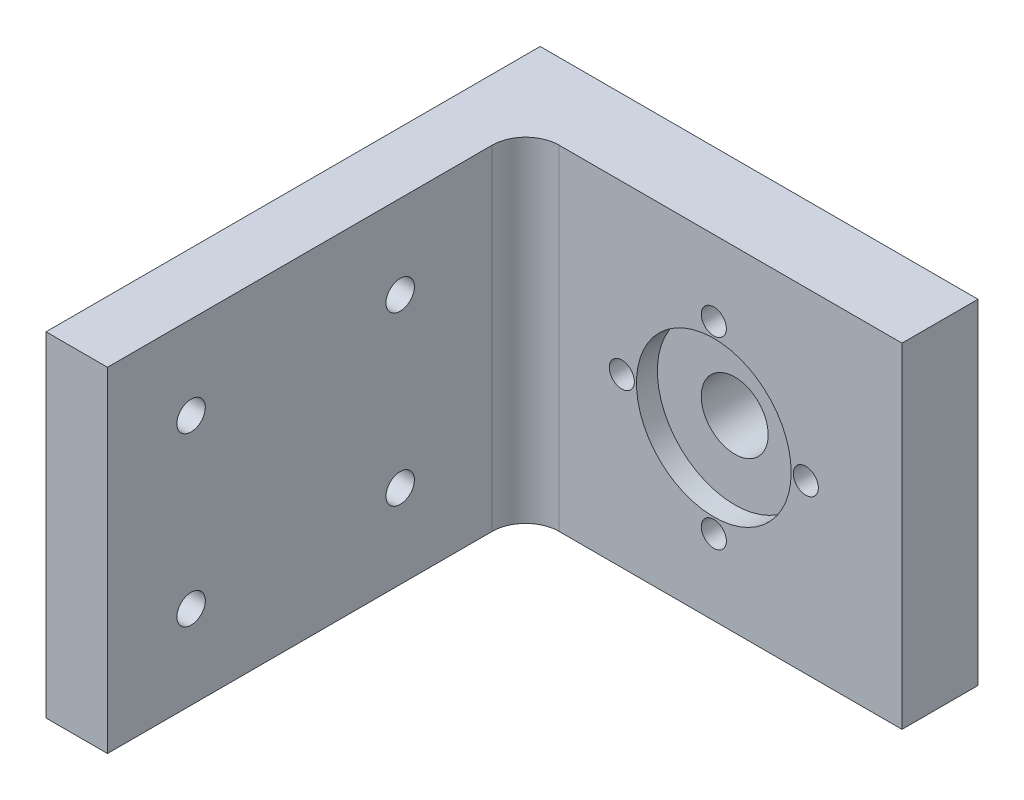
ISO-10303-21;
HEADER;
FILE_DESCRIPTION(('STEP AP214'),'2;1');
FILE_NAME('part.step','',(''),(''),'','','');
FILE_SCHEMA(('AUTOMOTIVE_DESIGN { 1 0 10303 214 1 1 1 1 }'));
ENDSEC;
DATA;
#1=APPLICATION_CONTEXT('core data for automotive mechanical design processes');
#2=APPLICATION_PROTOCOL_DEFINITION('international standard','automotive_design',2000,#1);
#3=PRODUCT_CONTEXT('',#1,'mechanical');
#4=PRODUCT('Part','Part','',(#3));
#5=PRODUCT_RELATED_PRODUCT_CATEGORY('part','',(#4));
#6=PRODUCT_DEFINITION_FORMATION('','',#4);
#7=PRODUCT_DEFINITION_CONTEXT('part definition',#1,'design');
#8=PRODUCT_DEFINITION('design','',#6,#7);
#9=PRODUCT_DEFINITION_SHAPE('','',#8);
#10=(LENGTH_UNIT() NAMED_UNIT(*) SI_UNIT(.MILLI.,.METRE.));
#11=(NAMED_UNIT(*) PLANE_ANGLE_UNIT() SI_UNIT($,.RADIAN.));
#12=(NAMED_UNIT(*) SI_UNIT($,.STERADIAN.) SOLID_ANGLE_UNIT());
#13=UNCERTAINTY_MEASURE_WITH_UNIT(LENGTH_MEASURE(1.E-05),#10,'distance_accuracy_value','');
#14=(GEOMETRIC_REPRESENTATION_CONTEXT(3) GLOBAL_UNCERTAINTY_ASSIGNED_CONTEXT((#13)) GLOBAL_UNIT_ASSIGNED_CONTEXT((#10,
#11,#12)) REPRESENTATION_CONTEXT('',''));
#15=CARTESIAN_POINT('',(0.,0.,0.));
#16=DIRECTION('',(0.,0.,1.));
#17=DIRECTION('',(1.,0.,0.));
#18=AXIS2_PLACEMENT_3D('',#15,#16,#17);
#19=CARTESIAN_POINT('',(22.5,-20.,9.09));
#20=DIRECTION('',(0.,-1.,0.));
#21=DIRECTION('',(0.,0.,-1.));
#22=AXIS2_PLACEMENT_3D('',#19,#20,#21);
#23=PLANE('',#22);
#24=DIRECTION('',(-1.,0.,0.));
#25=VECTOR('',#24,1.);
#26=CARTESIAN_POINT('',(22.5,-20.,0.));
#27=LINE('',#26,#25);
#28=CARTESIAN_POINT('',(22.5,-20.,0.));
#29=VERTEX_POINT('',#28);
#30=CARTESIAN_POINT('',(-29.85,-20.,0.));
#31=VERTEX_POINT('',#30);
#32=EDGE_CURVE('E114',#29,#31,#27,.T.);
#33=ORIENTED_EDGE('',*,*,#32,.F.);
#34=DIRECTION('',(0.,0.,-1.));
#35=VECTOR('',#34,1.);
#36=CARTESIAN_POINT('',(22.5,-20.,9.09));
#37=LINE('',#36,#35);
#38=CARTESIAN_POINT('',(22.5,-20.,9.09));
#39=VERTEX_POINT('',#38);
#40=EDGE_CURVE('E191',#39,#29,#37,.T.);
#41=ORIENTED_EDGE('',*,*,#40,.F.);
#42=DIRECTION('',(-1.,0.,0.));
#43=VECTOR('',#42,1.);
#44=CARTESIAN_POINT('',(22.5,-20.,9.09));
#45=LINE('',#44,#43);
#46=CARTESIAN_POINT('',(-18.5,-20.,9.09));
#47=VERTEX_POINT('',#46);
#48=EDGE_CURVE('E183',#39,#47,#45,.T.);
#49=ORIENTED_EDGE('',*,*,#48,.T.);
#50=CARTESIAN_POINT('',(-18.5,-20.,13.09));
#51=DIRECTION('',(0.,-1.,0.));
#52=DIRECTION('',(0.,0.,-1.));
#53=AXIS2_PLACEMENT_3D('',#50,#51,#52);
#54=CIRCLE('',#53,4.);
#55=CARTESIAN_POINT('',(-22.5,-20.,13.09));
#56=VERTEX_POINT('',#55);
#57=EDGE_CURVE('E11',#47,#56,#54,.F.);
#58=ORIENTED_EDGE('',*,*,#57,.T.);
#59=DIRECTION('',(0.,0.,1.));
#60=VECTOR('',#59,1.);
#61=CARTESIAN_POINT('',(-22.5,-20.,0.));
#62=LINE('',#61,#60);
#63=CARTESIAN_POINT('',(-22.5,-20.,59.09));
#64=VERTEX_POINT('',#63);
#65=EDGE_CURVE('E130',#56,#64,#62,.T.);
#66=ORIENTED_EDGE('',*,*,#65,.T.);
#67=DIRECTION('',(1.,0.,0.));
#68=VECTOR('',#67,1.);
#69=CARTESIAN_POINT('',(-29.85,-20.,59.09));
#70=LINE('',#69,#68);
#71=CARTESIAN_POINT('',(-29.85,-20.,59.09));
#72=VERTEX_POINT('',#71);
#73=EDGE_CURVE('E144',#72,#64,#70,.T.);
#74=ORIENTED_EDGE('',*,*,#73,.F.);
#75=DIRECTION('',(0.,0.,1.));
#76=VECTOR('',#75,1.);
#77=CARTESIAN_POINT('',(-29.85,-20.,0.));
#78=LINE('',#77,#76);
#79=EDGE_CURVE('E122',#31,#72,#78,.T.);
#80=ORIENTED_EDGE('',*,*,#79,.F.);
#81=EDGE_LOOP('',(#33,#41,#49,#58,#66,#74,#80));
#82=FACE_BOUND('',#81,.T.);
#83=ADVANCED_FACE('F44',(#82),#23,.T.);
#84=CARTESIAN_POINT('',(22.5,-20.,9.09));
#85=DIRECTION('',(-1.,0.,0.));
#86=DIRECTION('',(0.,0.,1.));
#87=AXIS2_PLACEMENT_3D('',#84,#85,#86);
#88=PLANE('',#87);
#89=DIRECTION('',(0.,1.,0.));
#90=VECTOR('',#89,1.);
#91=CARTESIAN_POINT('',(22.5,-20.,0.));
#92=LINE('',#91,#90);
#93=CARTESIAN_POINT('',(22.5,20.,0.));
#94=VERTEX_POINT('',#93);
#95=EDGE_CURVE('E113',#29,#94,#92,.T.);
#96=ORIENTED_EDGE('',*,*,#95,.T.);
#97=DIRECTION('',(0.,0.,-1.));
#98=VECTOR('',#97,1.);
#99=CARTESIAN_POINT('',(22.5,20.,9.09));
#100=LINE('',#99,#98);
#101=CARTESIAN_POINT('',(22.5,20.,9.09));
#102=VERTEX_POINT('',#101);
#103=EDGE_CURVE('E110',#102,#94,#100,.T.);
#104=ORIENTED_EDGE('',*,*,#103,.F.);
#105=DIRECTION('',(0.,1.,0.));
#106=VECTOR('',#105,1.);
#107=CARTESIAN_POINT('',(22.5,-20.,9.09));
#108=LINE('',#107,#106);
#109=EDGE_CURVE('E187',#39,#102,#108,.T.);
#110=ORIENTED_EDGE('',*,*,#109,.F.);
#111=ORIENTED_EDGE('',*,*,#40,.T.);
#112=EDGE_LOOP('',(#96,#104,#110,#111));
#113=FACE_BOUND('',#112,.T.);
#114=ADVANCED_FACE('F219',(#113),#88,.F.);
#115=CARTESIAN_POINT('',(22.5,20.,9.09));
#116=DIRECTION('',(0.,-1.,0.));
#117=DIRECTION('',(0.,0.,-1.));
#118=AXIS2_PLACEMENT_3D('',#115,#116,#117);
#119=PLANE('',#118);
#120=DIRECTION('',(-1.,0.,0.));
#121=VECTOR('',#120,1.);
#122=CARTESIAN_POINT('',(22.5,20.,0.));
#123=LINE('',#122,#121);
#124=CARTESIAN_POINT('',(-29.85,20.,0.));
#125=VERTEX_POINT('',#124);
#126=EDGE_CURVE('E103',#94,#125,#123,.T.);
#127=ORIENTED_EDGE('',*,*,#126,.T.);
#128=DIRECTION('',(0.,0.,-1.));
#129=VECTOR('',#128,1.);
#130=CARTESIAN_POINT('',(-29.85,20.,0.));
#131=LINE('',#130,#129);
#132=CARTESIAN_POINT('',(-29.85,20.,59.09));
#133=VERTEX_POINT('',#132);
#134=EDGE_CURVE('E108',#133,#125,#131,.T.);
#135=ORIENTED_EDGE('',*,*,#134,.F.);
#136=DIRECTION('',(1.,0.,0.));
#137=VECTOR('',#136,1.);
#138=CARTESIAN_POINT('',(-29.85,20.,59.09));
#139=LINE('',#138,#137);
#140=CARTESIAN_POINT('',(-22.5,20.,59.09));
#141=VERTEX_POINT('',#140);
#142=EDGE_CURVE('E138',#133,#141,#139,.T.);
#143=ORIENTED_EDGE('',*,*,#142,.T.);
#144=DIRECTION('',(0.,0.,-1.));
#145=VECTOR('',#144,1.);
#146=CARTESIAN_POINT('',(-22.5,20.,0.));
#147=LINE('',#146,#145);
#148=CARTESIAN_POINT('',(-22.5,20.,13.09));
#149=VERTEX_POINT('',#148);
#150=EDGE_CURVE('E139',#141,#149,#147,.T.);
#151=ORIENTED_EDGE('',*,*,#150,.T.);
#152=CARTESIAN_POINT('',(-18.5,20.,13.09));
#153=DIRECTION('',(0.,-1.,0.));
#154=DIRECTION('',(0.,0.,-1.));
#155=AXIS2_PLACEMENT_3D('',#152,#153,#154);
#156=CIRCLE('',#155,4.);
#157=CARTESIAN_POINT('',(-18.5,20.,9.09));
#158=VERTEX_POINT('',#157);
#159=EDGE_CURVE('E52',#149,#158,#156,.T.);
#160=ORIENTED_EDGE('',*,*,#159,.T.);
#161=DIRECTION('',(-1.,0.,0.));
#162=VECTOR('',#161,1.);
#163=CARTESIAN_POINT('',(22.5,20.,9.09));
#164=LINE('',#163,#162);
#165=EDGE_CURVE('E185',#102,#158,#164,.T.);
#166=ORIENTED_EDGE('',*,*,#165,.F.);
#167=ORIENTED_EDGE('',*,*,#103,.T.);
#168=EDGE_LOOP('',(#127,#135,#143,#151,#160,#166,#167));
#169=FACE_BOUND('',#168,.T.);
#170=ADVANCED_FACE('F105',(#169),#119,.F.);
#171=CARTESIAN_POINT('',(0.,0.,9.09));
#172=DIRECTION('',(0.,0.,-1.));
#173=DIRECTION('',(-1.,0.,0.));
#174=AXIS2_PLACEMENT_3D('',#171,#172,#173);
#175=PLANE('',#174);
#176=CARTESIAN_POINT('',(0.,0.,9.09));
#177=DIRECTION('',(0.,0.,1.));
#178=DIRECTION('',(1.,0.,0.));
#179=AXIS2_PLACEMENT_3D('',#176,#177,#178);
#180=CIRCLE('',#179,9.25);
#181=CARTESIAN_POINT('',(9.25,0.,9.09));
#182=VERTEX_POINT('',#181);
#183=EDGE_CURVE('E151',#182,#182,#180,.T.);
#184=ORIENTED_EDGE('',*,*,#183,.F.);
#185=EDGE_LOOP('',(#184));
#186=FACE_BOUND('',#185,.T.);
#187=CARTESIAN_POINT('',(0.,11.,9.09));
#188=DIRECTION('',(0.,0.,1.));
#189=DIRECTION('',(1.,0.,0.));
#190=AXIS2_PLACEMENT_3D('',#187,#188,#189);
#191=CIRCLE('',#190,1.5);
#192=CARTESIAN_POINT('',(1.5,11.,9.09));
#193=VERTEX_POINT('',#192);
#194=EDGE_CURVE('E163',#193,#193,#191,.T.);
#195=ORIENTED_EDGE('',*,*,#194,.F.);
#196=EDGE_LOOP('',(#195));
#197=FACE_BOUND('',#196,.T.);
#198=CARTESIAN_POINT('',(11.,0.,9.09));
#199=DIRECTION('',(0.,0.,1.));
#200=DIRECTION('',(1.,0.,0.));
#201=AXIS2_PLACEMENT_3D('',#198,#199,#200);
#202=CIRCLE('',#201,1.5);
#203=CARTESIAN_POINT('',(12.5,0.,9.09));
#204=VERTEX_POINT('',#203);
#205=EDGE_CURVE('E166',#204,#204,#202,.T.);
#206=ORIENTED_EDGE('',*,*,#205,.F.);
#207=EDGE_LOOP('',(#206));
#208=FACE_BOUND('',#207,.T.);
#209=CARTESIAN_POINT('',(0.,-11.,9.09));
#210=DIRECTION('',(0.,0.,1.));
#211=DIRECTION('',(1.,0.,0.));
#212=AXIS2_PLACEMENT_3D('',#209,#210,#211);
#213=CIRCLE('',#212,1.5);
#214=CARTESIAN_POINT('',(1.5,-11.,9.09));
#215=VERTEX_POINT('',#214);
#216=EDGE_CURVE('E172',#215,#215,#213,.T.);
#217=ORIENTED_EDGE('',*,*,#216,.F.);
#218=EDGE_LOOP('',(#217));
#219=FACE_BOUND('',#218,.T.);
#220=CARTESIAN_POINT('',(-11.,0.,9.09));
#221=DIRECTION('',(0.,0.,1.));
#222=DIRECTION('',(1.,0.,0.));
#223=AXIS2_PLACEMENT_3D('',#220,#221,#222);
#224=CIRCLE('',#223,1.5);
#225=CARTESIAN_POINT('',(-9.5,0.,9.09));
#226=VERTEX_POINT('',#225);
#227=EDGE_CURVE('E178',#226,#226,#224,.T.);
#228=ORIENTED_EDGE('',*,*,#227,.F.);
#229=EDGE_LOOP('',(#228));
#230=FACE_BOUND('',#229,.T.);
#231=ORIENTED_EDGE('',*,*,#165,.T.);
#232=DIRECTION('',(0.,1.,0.));
#233=VECTOR('',#232,1.);
#234=CARTESIAN_POINT('',(-18.5,0.,9.09));
#235=LINE('',#234,#233);
#236=EDGE_CURVE('E65',#158,#47,#235,.F.);
#237=ORIENTED_EDGE('',*,*,#236,.T.);
#238=ORIENTED_EDGE('',*,*,#48,.F.);
#239=ORIENTED_EDGE('',*,*,#109,.T.);
#240=EDGE_LOOP('',(#231,#237,#238,#239));
#241=FACE_BOUND('',#240,.T.);
#242=ADVANCED_FACE('F227',(#186,#197,#208,#219,#230,#241),#175,.F.);
#243=CARTESIAN_POINT('',(0.,0.,0.));
#244=DIRECTION('',(0.,0.,-1.));
#245=DIRECTION('',(-1.,0.,0.));
#246=AXIS2_PLACEMENT_3D('',#243,#244,#245);
#247=PLANE('',#246);
#248=CARTESIAN_POINT('',(0.,0.,0.));
#249=DIRECTION('',(0.,0.,1.));
#250=DIRECTION('',(1.,0.,0.));
#251=AXIS2_PLACEMENT_3D('',#248,#249,#250);
#252=CIRCLE('',#251,4.);
#253=CARTESIAN_POINT('',(4.,0.,0.));
#254=VERTEX_POINT('',#253);
#255=EDGE_CURVE('E148',#254,#254,#252,.T.);
#256=ORIENTED_EDGE('',*,*,#255,.T.);
#257=EDGE_LOOP('',(#256));
#258=FACE_BOUND('',#257,.T.);
#259=CARTESIAN_POINT('',(0.,11.,0.));
#260=DIRECTION('',(0.,0.,1.));
#261=DIRECTION('',(1.,0.,0.));
#262=AXIS2_PLACEMENT_3D('',#259,#260,#261);
#263=CIRCLE('',#262,1.5);
#264=CARTESIAN_POINT('',(1.5,11.,0.));
#265=VERTEX_POINT('',#264);
#266=EDGE_CURVE('E160',#265,#265,#263,.T.);
#267=ORIENTED_EDGE('',*,*,#266,.T.);
#268=EDGE_LOOP('',(#267));
#269=FACE_BOUND('',#268,.T.);
#270=CARTESIAN_POINT('',(11.,0.,0.));
#271=DIRECTION('',(0.,0.,1.));
#272=DIRECTION('',(1.,0.,0.));
#273=AXIS2_PLACEMENT_3D('',#270,#271,#272);
#274=CIRCLE('',#273,1.5);
#275=CARTESIAN_POINT('',(12.5,0.,0.));
#276=VERTEX_POINT('',#275);
#277=EDGE_CURVE('E169',#276,#276,#274,.T.);
#278=ORIENTED_EDGE('',*,*,#277,.T.);
#279=EDGE_LOOP('',(#278));
#280=FACE_BOUND('',#279,.T.);
#281=CARTESIAN_POINT('',(0.,-11.,0.));
#282=DIRECTION('',(0.,0.,1.));
#283=DIRECTION('',(1.,0.,0.));
#284=AXIS2_PLACEMENT_3D('',#281,#282,#283);
#285=CIRCLE('',#284,1.5);
#286=CARTESIAN_POINT('',(1.5,-11.,0.));
#287=VERTEX_POINT('',#286);
#288=EDGE_CURVE('E175',#287,#287,#285,.T.);
#289=ORIENTED_EDGE('',*,*,#288,.T.);
#290=EDGE_LOOP('',(#289));
#291=FACE_BOUND('',#290,.T.);
#292=CARTESIAN_POINT('',(-11.,0.,0.));
#293=DIRECTION('',(0.,0.,1.));
#294=DIRECTION('',(1.,0.,0.));
#295=AXIS2_PLACEMENT_3D('',#292,#293,#294);
#296=CIRCLE('',#295,1.5);
#297=CARTESIAN_POINT('',(-9.5,0.,0.));
#298=VERTEX_POINT('',#297);
#299=EDGE_CURVE('E157',#298,#298,#296,.T.);
#300=ORIENTED_EDGE('',*,*,#299,.T.);
#301=EDGE_LOOP('',(#300));
#302=FACE_BOUND('',#301,.T.);
#303=ORIENTED_EDGE('',*,*,#32,.T.);
#304=DIRECTION('',(0.,-1.,0.));
#305=VECTOR('',#304,1.);
#306=CARTESIAN_POINT('',(-29.85,20.,0.));
#307=LINE('',#306,#305);
#308=EDGE_CURVE('E117',#125,#31,#307,.T.);
#309=ORIENTED_EDGE('',*,*,#308,.F.);
#310=ORIENTED_EDGE('',*,*,#126,.F.);
#311=ORIENTED_EDGE('',*,*,#95,.F.);
#312=EDGE_LOOP('',(#303,#309,#310,#311));
#313=FACE_BOUND('',#312,.T.);
#314=ADVANCED_FACE('F118',(#258,#269,#280,#291,#302,#313),#247,.T.);
#315=CARTESIAN_POINT('',(-11.,0.,0.));
#316=DIRECTION('',(0.,0.,1.));
#317=DIRECTION('',(1.,0.,0.));
#318=AXIS2_PLACEMENT_3D('',#315,#316,#317);
#319=CYLINDRICAL_SURFACE('',#318,1.5);
#320=ORIENTED_EDGE('',*,*,#299,.F.);
#321=EDGE_LOOP('',(#320));
#322=FACE_BOUND('',#321,.T.);
#323=ORIENTED_EDGE('',*,*,#227,.T.);
#324=EDGE_LOOP('',(#323));
#325=FACE_BOUND('',#324,.T.);
#326=ADVANCED_FACE('F231',(#322,#325),#319,.F.);
#327=CARTESIAN_POINT('',(0.,-11.,0.));
#328=DIRECTION('',(0.,0.,1.));
#329=DIRECTION('',(1.,0.,0.));
#330=AXIS2_PLACEMENT_3D('',#327,#328,#329);
#331=CYLINDRICAL_SURFACE('',#330,1.5);
#332=ORIENTED_EDGE('',*,*,#288,.F.);
#333=EDGE_LOOP('',(#332));
#334=FACE_BOUND('',#333,.T.);
#335=ORIENTED_EDGE('',*,*,#216,.T.);
#336=EDGE_LOOP('',(#335));
#337=FACE_BOUND('',#336,.T.);
#338=ADVANCED_FACE('F238',(#334,#337),#331,.F.);
#339=CARTESIAN_POINT('',(11.,0.,0.));
#340=DIRECTION('',(0.,0.,1.));
#341=DIRECTION('',(1.,0.,0.));
#342=AXIS2_PLACEMENT_3D('',#339,#340,#341);
#343=CYLINDRICAL_SURFACE('',#342,1.5);
#344=ORIENTED_EDGE('',*,*,#277,.F.);
#345=EDGE_LOOP('',(#344));
#346=FACE_BOUND('',#345,.T.);
#347=ORIENTED_EDGE('',*,*,#205,.T.);
#348=EDGE_LOOP('',(#347));
#349=FACE_BOUND('',#348,.T.);
#350=ADVANCED_FACE('F242',(#346,#349),#343,.F.);
#351=CARTESIAN_POINT('',(0.,11.,0.));
#352=DIRECTION('',(0.,0.,1.));
#353=DIRECTION('',(1.,0.,0.));
#354=AXIS2_PLACEMENT_3D('',#351,#352,#353);
#355=CYLINDRICAL_SURFACE('',#354,1.5);
#356=ORIENTED_EDGE('',*,*,#266,.F.);
#357=EDGE_LOOP('',(#356));
#358=FACE_BOUND('',#357,.T.);
#359=ORIENTED_EDGE('',*,*,#194,.T.);
#360=EDGE_LOOP('',(#359));
#361=FACE_BOUND('',#360,.T.);
#362=ADVANCED_FACE('F246',(#358,#361),#355,.F.);
#363=CARTESIAN_POINT('',(0.,0.,6.59));
#364=DIRECTION('',(0.,0.,1.));
#365=DIRECTION('',(1.,0.,0.));
#366=AXIS2_PLACEMENT_3D('',#363,#364,#365);
#367=CYLINDRICAL_SURFACE('',#366,9.25);
#368=CARTESIAN_POINT('',(0.,0.,6.59));
#369=DIRECTION('',(0.,0.,1.));
#370=DIRECTION('',(1.,0.,0.));
#371=AXIS2_PLACEMENT_3D('',#368,#369,#370);
#372=CIRCLE('',#371,9.25);
#373=CARTESIAN_POINT('',(9.25,0.,6.59));
#374=VERTEX_POINT('',#373);
#375=EDGE_CURVE('E154',#374,#374,#372,.T.);
#376=ORIENTED_EDGE('',*,*,#375,.F.);
#377=EDGE_LOOP('',(#376));
#378=FACE_BOUND('',#377,.T.);
#379=ORIENTED_EDGE('',*,*,#183,.T.);
#380=EDGE_LOOP('',(#379));
#381=FACE_BOUND('',#380,.T.);
#382=ADVANCED_FACE('F250',(#378,#381),#367,.F.);
#383=CARTESIAN_POINT('',(0.,0.,6.59));
#384=DIRECTION('',(0.,0.,1.));
#385=DIRECTION('',(1.,0.,0.));
#386=AXIS2_PLACEMENT_3D('',#383,#384,#385);
#387=PLANE('',#386);
#388=CARTESIAN_POINT('',(0.,0.,6.59));
#389=DIRECTION('',(0.,0.,1.));
#390=DIRECTION('',(1.,0.,0.));
#391=AXIS2_PLACEMENT_3D('',#388,#389,#390);
#392=CIRCLE('',#391,4.);
#393=CARTESIAN_POINT('',(4.,0.,6.59));
#394=VERTEX_POINT('',#393);
#395=EDGE_CURVE('E147',#394,#394,#392,.T.);
#396=ORIENTED_EDGE('',*,*,#395,.F.);
#397=EDGE_LOOP('',(#396));
#398=FACE_BOUND('',#397,.T.);
#399=ORIENTED_EDGE('',*,*,#375,.T.);
#400=EDGE_LOOP('',(#399));
#401=FACE_BOUND('',#400,.T.);
#402=ADVANCED_FACE('F254',(#398,#401),#387,.T.);
#403=CARTESIAN_POINT('',(0.,0.,0.));
#404=DIRECTION('',(0.,0.,1.));
#405=DIRECTION('',(1.,0.,0.));
#406=AXIS2_PLACEMENT_3D('',#403,#404,#405);
#407=CYLINDRICAL_SURFACE('',#406,4.);
#408=ORIENTED_EDGE('',*,*,#255,.F.);
#409=EDGE_LOOP('',(#408));
#410=FACE_BOUND('',#409,.T.);
#411=ORIENTED_EDGE('',*,*,#395,.T.);
#412=EDGE_LOOP('',(#411));
#413=FACE_BOUND('',#412,.T.);
#414=ADVANCED_FACE('F258',(#410,#413),#407,.F.);
#415=CARTESIAN_POINT('',(-29.85,20.,59.09));
#416=DIRECTION('',(0.,0.,-1.));
#417=DIRECTION('',(-1.,0.,0.));
#418=AXIS2_PLACEMENT_3D('',#415,#416,#417);
#419=PLANE('',#418);
#420=DIRECTION('',(0.,1.,0.));
#421=VECTOR('',#420,1.);
#422=CARTESIAN_POINT('',(-22.5,20.,59.09));
#423=LINE('',#422,#421);
#424=EDGE_CURVE('E128',#64,#141,#423,.T.);
#425=ORIENTED_EDGE('',*,*,#424,.T.);
#426=ORIENTED_EDGE('',*,*,#142,.F.);
#427=DIRECTION('',(0.,1.,0.));
#428=VECTOR('',#427,1.);
#429=CARTESIAN_POINT('',(-29.85,20.,59.09));
#430=LINE('',#429,#428);
#431=EDGE_CURVE('E126',#72,#133,#430,.T.);
#432=ORIENTED_EDGE('',*,*,#431,.F.);
#433=ORIENTED_EDGE('',*,*,#73,.T.);
#434=EDGE_LOOP('',(#425,#426,#432,#433));
#435=FACE_BOUND('',#434,.T.);
#436=ADVANCED_FACE('F206',(#435),#419,.F.);
#437=CARTESIAN_POINT('',(-29.85,0.,0.));
#438=DIRECTION('',(1.,0.,0.));
#439=DIRECTION('',(0.,0.,-1.));
#440=AXIS2_PLACEMENT_3D('',#437,#438,#439);
#441=PLANE('',#440);
#442=CARTESIAN_POINT('',(-29.85,10.,49.09));
#443=DIRECTION('',(1.,0.,0.));
#444=DIRECTION('',(0.,0.,-1.));
#445=AXIS2_PLACEMENT_3D('',#442,#443,#444);
#446=CIRCLE('',#445,1.7);
#447=CARTESIAN_POINT('',(-29.85,10.,47.39));
#448=VERTEX_POINT('',#447);
#449=EDGE_CURVE('E300',#448,#448,#446,.T.);
#450=ORIENTED_EDGE('',*,*,#449,.T.);
#451=EDGE_LOOP('',(#450));
#452=FACE_BOUND('',#451,.T.);
#453=CARTESIAN_POINT('',(-29.85,-9.99999999999999,24.09));
#454=DIRECTION('',(1.,0.,0.));
#455=DIRECTION('',(0.,0.,-1.));
#456=AXIS2_PLACEMENT_3D('',#453,#454,#455);
#457=CIRCLE('',#456,1.7);
#458=CARTESIAN_POINT('',(-29.85,-9.99999999999999,22.39));
#459=VERTEX_POINT('',#458);
#460=EDGE_CURVE('E290',#459,#459,#457,.T.);
#461=ORIENTED_EDGE('',*,*,#460,.T.);
#462=EDGE_LOOP('',(#461));
#463=FACE_BOUND('',#462,.T.);
#464=CARTESIAN_POINT('',(-29.85,10.,24.09));
#465=DIRECTION('',(1.,0.,0.));
#466=DIRECTION('',(0.,0.,-1.));
#467=AXIS2_PLACEMENT_3D('',#464,#465,#466);
#468=CIRCLE('',#467,1.7);
#469=CARTESIAN_POINT('',(-29.85,10.,22.39));
#470=VERTEX_POINT('',#469);
#471=EDGE_CURVE('E285',#470,#470,#468,.T.);
#472=ORIENTED_EDGE('',*,*,#471,.T.);
#473=EDGE_LOOP('',(#472));
#474=FACE_BOUND('',#473,.T.);
#475=CARTESIAN_POINT('',(-29.85,-9.99999999999999,49.09));
#476=DIRECTION('',(1.,0.,0.));
#477=DIRECTION('',(0.,0.,-1.));
#478=AXIS2_PLACEMENT_3D('',#475,#476,#477);
#479=CIRCLE('',#478,1.7);
#480=CARTESIAN_POINT('',(-29.85,-9.99999999999999,47.39));
#481=VERTEX_POINT('',#480);
#482=EDGE_CURVE('E141',#481,#481,#479,.T.);
#483=ORIENTED_EDGE('',*,*,#482,.T.);
#484=EDGE_LOOP('',(#483));
#485=FACE_BOUND('',#484,.T.);
#486=ORIENTED_EDGE('',*,*,#134,.T.);
#487=ORIENTED_EDGE('',*,*,#308,.T.);
#488=ORIENTED_EDGE('',*,*,#79,.T.);
#489=ORIENTED_EDGE('',*,*,#431,.T.);
#490=EDGE_LOOP('',(#486,#487,#488,#489));
#491=FACE_BOUND('',#490,.T.);
#492=ADVANCED_FACE('F124',(#452,#463,#474,#485,#491),#441,.F.);
#493=CARTESIAN_POINT('',(-22.5,0.,0.));
#494=DIRECTION('',(1.,0.,0.));
#495=DIRECTION('',(0.,0.,-1.));
#496=AXIS2_PLACEMENT_3D('',#493,#494,#495);
#497=PLANE('',#496);
#498=CARTESIAN_POINT('',(-22.5,10.,49.09));
#499=DIRECTION('',(1.,0.,0.));
#500=DIRECTION('',(0.,0.,-1.));
#501=AXIS2_PLACEMENT_3D('',#498,#499,#500);
#502=CIRCLE('',#501,1.7);
#503=CARTESIAN_POINT('',(-22.5,10.,47.39));
#504=VERTEX_POINT('',#503);
#505=EDGE_CURVE('E297',#504,#504,#502,.T.);
#506=ORIENTED_EDGE('',*,*,#505,.F.);
#507=EDGE_LOOP('',(#506));
#508=FACE_BOUND('',#507,.T.);
#509=CARTESIAN_POINT('',(-22.5,-9.99999999999999,24.09));
#510=DIRECTION('',(1.,0.,0.));
#511=DIRECTION('',(0.,0.,-1.));
#512=AXIS2_PLACEMENT_3D('',#509,#510,#511);
#513=CIRCLE('',#512,1.7);
#514=CARTESIAN_POINT('',(-22.5,-9.99999999999999,22.39));
#515=VERTEX_POINT('',#514);
#516=EDGE_CURVE('E293',#515,#515,#513,.T.);
#517=ORIENTED_EDGE('',*,*,#516,.F.);
#518=EDGE_LOOP('',(#517));
#519=FACE_BOUND('',#518,.T.);
#520=CARTESIAN_POINT('',(-22.5,10.,24.09));
#521=DIRECTION('',(1.,0.,0.));
#522=DIRECTION('',(0.,0.,-1.));
#523=AXIS2_PLACEMENT_3D('',#520,#521,#522);
#524=CIRCLE('',#523,1.7);
#525=CARTESIAN_POINT('',(-22.5,10.,22.39));
#526=VERTEX_POINT('',#525);
#527=EDGE_CURVE('E288',#526,#526,#524,.T.);
#528=ORIENTED_EDGE('',*,*,#527,.F.);
#529=EDGE_LOOP('',(#528));
#530=FACE_BOUND('',#529,.T.);
#531=CARTESIAN_POINT('',(-22.5,-9.99999999999999,49.09));
#532=DIRECTION('',(1.,0.,0.));
#533=DIRECTION('',(0.,0.,-1.));
#534=AXIS2_PLACEMENT_3D('',#531,#532,#533);
#535=CIRCLE('',#534,1.7);
#536=CARTESIAN_POINT('',(-22.5,-9.99999999999999,47.39));
#537=VERTEX_POINT('',#536);
#538=EDGE_CURVE('E133',#537,#537,#535,.T.);
#539=ORIENTED_EDGE('',*,*,#538,.F.);
#540=EDGE_LOOP('',(#539));
#541=FACE_BOUND('',#540,.T.);
#542=ORIENTED_EDGE('',*,*,#65,.F.);
#543=DIRECTION('',(0.,1.,0.));
#544=VECTOR('',#543,1.);
#545=CARTESIAN_POINT('',(-22.5,0.,13.09));
#546=LINE('',#545,#544);
#547=EDGE_CURVE('E193',#56,#149,#546,.T.);
#548=ORIENTED_EDGE('',*,*,#547,.T.);
#549=ORIENTED_EDGE('',*,*,#150,.F.);
#550=ORIENTED_EDGE('',*,*,#424,.F.);
#551=EDGE_LOOP('',(#542,#548,#549,#550));
#552=FACE_BOUND('',#551,.T.);
#553=ADVANCED_FACE('F201',(#508,#519,#530,#541,#552),#497,.T.);
#554=CARTESIAN_POINT('',(-29.85,-9.99999999999999,49.09));
#555=DIRECTION('',(1.,0.,0.));
#556=DIRECTION('',(0.,0.,-1.));
#557=AXIS2_PLACEMENT_3D('',#554,#555,#556);
#558=CYLINDRICAL_SURFACE('',#557,1.7);
#559=ORIENTED_EDGE('',*,*,#482,.F.);
#560=EDGE_LOOP('',(#559));
#561=FACE_BOUND('',#560,.T.);
#562=ORIENTED_EDGE('',*,*,#538,.T.);
#563=EDGE_LOOP('',(#562));
#564=FACE_BOUND('',#563,.T.);
#565=ADVANCED_FACE('F266',(#561,#564),#558,.F.);
#566=CARTESIAN_POINT('',(-29.85,10.,24.09));
#567=DIRECTION('',(1.,0.,0.));
#568=DIRECTION('',(0.,0.,-1.));
#569=AXIS2_PLACEMENT_3D('',#566,#567,#568);
#570=CYLINDRICAL_SURFACE('',#569,1.7);
#571=ORIENTED_EDGE('',*,*,#471,.F.);
#572=EDGE_LOOP('',(#571));
#573=FACE_BOUND('',#572,.T.);
#574=ORIENTED_EDGE('',*,*,#527,.T.);
#575=EDGE_LOOP('',(#574));
#576=FACE_BOUND('',#575,.T.);
#577=ADVANCED_FACE('F273',(#573,#576),#570,.F.);
#578=CARTESIAN_POINT('',(-29.85,-9.99999999999999,24.09));
#579=DIRECTION('',(1.,0.,0.));
#580=DIRECTION('',(0.,0.,-1.));
#581=AXIS2_PLACEMENT_3D('',#578,#579,#580);
#582=CYLINDRICAL_SURFACE('',#581,1.7);
#583=ORIENTED_EDGE('',*,*,#460,.F.);
#584=EDGE_LOOP('',(#583));
#585=FACE_BOUND('',#584,.T.);
#586=ORIENTED_EDGE('',*,*,#516,.T.);
#587=EDGE_LOOP('',(#586));
#588=FACE_BOUND('',#587,.T.);
#589=ADVANCED_FACE('F215',(#585,#588),#582,.F.);
#590=CARTESIAN_POINT('',(-29.85,10.,49.09));
#591=DIRECTION('',(1.,0.,0.));
#592=DIRECTION('',(0.,0.,-1.));
#593=AXIS2_PLACEMENT_3D('',#590,#591,#592);
#594=CYLINDRICAL_SURFACE('',#593,1.7);
#595=ORIENTED_EDGE('',*,*,#449,.F.);
#596=EDGE_LOOP('',(#595));
#597=FACE_BOUND('',#596,.T.);
#598=ORIENTED_EDGE('',*,*,#505,.T.);
#599=EDGE_LOOP('',(#598));
#600=FACE_BOUND('',#599,.T.);
#601=ADVANCED_FACE('F210',(#597,#600),#594,.F.);
#602=CARTESIAN_POINT('',(-18.5,0.,13.09));
#603=DIRECTION('',(0.,1.,0.));
#604=DIRECTION('',(0.,0.,1.));
#605=AXIS2_PLACEMENT_3D('',#602,#603,#604);
#606=CYLINDRICAL_SURFACE('',#605,4.);
#607=ORIENTED_EDGE('',*,*,#57,.F.);
#608=ORIENTED_EDGE('',*,*,#236,.F.);
#609=ORIENTED_EDGE('',*,*,#159,.F.);
#610=ORIENTED_EDGE('',*,*,#547,.F.);
#611=EDGE_LOOP('',(#607,#608,#609,#610));
#612=FACE_BOUND('',#611,.T.);
#613=ADVANCED_FACE('F46',(#612),#606,.F.);
#614=CLOSED_SHELL('',(#83,#114,#170,#242,#314,#326,#338,#350,#362,#382,#402,#414,#436,#492,#553,
#565,#577,#589,#601,#613));
#615=MANIFOLD_SOLID_BREP('B2',#614);
#616=ADVANCED_BREP_SHAPE_REPRESENTATION('',(#18,#615),#14);
#617=SHAPE_DEFINITION_REPRESENTATION(#9,#616);
ENDSEC;
END-ISO-10303-21;
